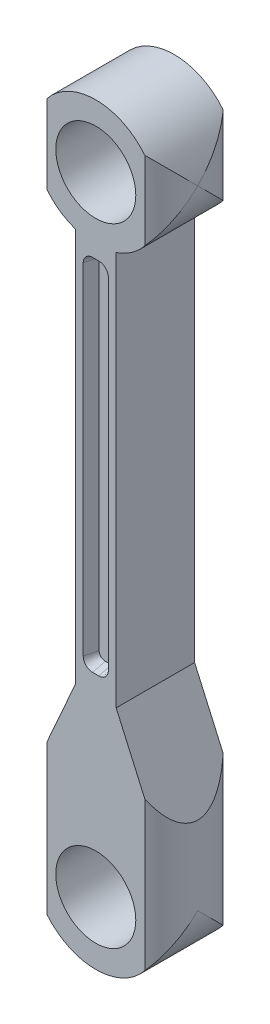
ISO-10303-21;
HEADER;
FILE_DESCRIPTION(('STEP AP214'),'2;1');
FILE_NAME('part.step','',(''),(''),'','','');
FILE_SCHEMA(('AUTOMOTIVE_DESIGN { 1 0 10303 214 1 1 1 1 }'));
ENDSEC;
DATA;
#1=APPLICATION_CONTEXT('core data for automotive mechanical design processes');
#2=APPLICATION_PROTOCOL_DEFINITION('international standard','automotive_design',2000,#1);
#3=PRODUCT_CONTEXT('',#1,'mechanical');
#4=PRODUCT('Part','Part','',(#3));
#5=PRODUCT_RELATED_PRODUCT_CATEGORY('part','',(#4));
#6=PRODUCT_DEFINITION_FORMATION('','',#4);
#7=PRODUCT_DEFINITION_CONTEXT('part definition',#1,'design');
#8=PRODUCT_DEFINITION('design','',#6,#7);
#9=PRODUCT_DEFINITION_SHAPE('','',#8);
#10=(LENGTH_UNIT() NAMED_UNIT(*) SI_UNIT(.MILLI.,.METRE.));
#11=(NAMED_UNIT(*) PLANE_ANGLE_UNIT() SI_UNIT($,.RADIAN.));
#12=(NAMED_UNIT(*) SI_UNIT($,.STERADIAN.) SOLID_ANGLE_UNIT());
#13=UNCERTAINTY_MEASURE_WITH_UNIT(LENGTH_MEASURE(1.E-05),#10,'distance_accuracy_value','');
#14=(GEOMETRIC_REPRESENTATION_CONTEXT(3) GLOBAL_UNCERTAINTY_ASSIGNED_CONTEXT((#13)) GLOBAL_UNIT_ASSIGNED_CONTEXT((#10,
#11,#12)) REPRESENTATION_CONTEXT('',''));
#15=CARTESIAN_POINT('',(0.,0.,0.));
#16=DIRECTION('',(0.,0.,1.));
#17=DIRECTION('',(1.,0.,0.));
#18=AXIS2_PLACEMENT_3D('',#15,#16,#17);
#19=CARTESIAN_POINT('',(0.,0.,6.35));
#20=DIRECTION('',(0.,0.,1.));
#21=DIRECTION('',(1.,0.,0.));
#22=AXIS2_PLACEMENT_3D('',#19,#20,#21);
#23=PLANE('',#22);
#24=CARTESIAN_POINT('',(-0.508,87.884,6.35));
#25=DIRECTION('',(0.,0.,1.));
#26=DIRECTION('',(1.,0.,0.));
#27=AXIS2_PLACEMENT_3D('',#24,#25,#26);
#28=CIRCLE('',#27,1.524);
#29=CARTESIAN_POINT('',(-0.507999999999989,89.408,6.35));
#30=VERTEX_POINT('',#29);
#31=CARTESIAN_POINT('',(-2.032,87.884,6.35));
#32=VERTEX_POINT('',#31);
#33=EDGE_CURVE('E271',#30,#32,#28,.T.);
#34=ORIENTED_EDGE('',*,*,#33,.F.);
#35=DIRECTION('',(1.,0.,0.));
#36=VECTOR('',#35,1.);
#37=CARTESIAN_POINT('',(0.,89.408,6.35));
#38=LINE('',#37,#36);
#39=CARTESIAN_POINT('',(0.507999999999989,89.408,6.35));
#40=VERTEX_POINT('',#39);
#41=EDGE_CURVE('E352',#30,#40,#38,.T.);
#42=ORIENTED_EDGE('',*,*,#41,.T.);
#43=CARTESIAN_POINT('',(0.508,87.884,6.35));
#44=DIRECTION('',(0.,0.,1.));
#45=DIRECTION('',(1.,0.,0.));
#46=AXIS2_PLACEMENT_3D('',#43,#44,#45);
#47=CIRCLE('',#46,1.524);
#48=CARTESIAN_POINT('',(2.032,87.884,6.35));
#49=VERTEX_POINT('',#48);
#50=EDGE_CURVE('E348',#49,#40,#47,.T.);
#51=ORIENTED_EDGE('',*,*,#50,.F.);
#52=DIRECTION('',(0.,-1.,0.));
#53=VECTOR('',#52,1.);
#54=CARTESIAN_POINT('',(2.032,0.,6.35));
#55=LINE('',#54,#53);
#56=CARTESIAN_POINT('',(2.032,32.766,6.35));
#57=VERTEX_POINT('',#56);
#58=EDGE_CURVE('E344',#49,#57,#55,.T.);
#59=ORIENTED_EDGE('',*,*,#58,.T.);
#60=CARTESIAN_POINT('',(0.508,32.766,6.35));
#61=DIRECTION('',(0.,0.,1.));
#62=DIRECTION('',(1.,0.,0.));
#63=AXIS2_PLACEMENT_3D('',#60,#61,#62);
#64=CIRCLE('',#63,1.524);
#65=CARTESIAN_POINT('',(0.507999999999989,31.242,6.35));
#66=VERTEX_POINT('',#65);
#67=EDGE_CURVE('E340',#66,#57,#64,.T.);
#68=ORIENTED_EDGE('',*,*,#67,.F.);
#69=DIRECTION('',(-1.,0.,0.));
#70=VECTOR('',#69,1.);
#71=CARTESIAN_POINT('',(0.,31.242,6.35));
#72=LINE('',#71,#70);
#73=CARTESIAN_POINT('',(-0.507999999999989,31.242,6.35));
#74=VERTEX_POINT('',#73);
#75=EDGE_CURVE('E336',#66,#74,#72,.T.);
#76=ORIENTED_EDGE('',*,*,#75,.T.);
#77=CARTESIAN_POINT('',(-0.508,32.766,6.35));
#78=DIRECTION('',(0.,0.,1.));
#79=DIRECTION('',(1.,0.,0.));
#80=AXIS2_PLACEMENT_3D('',#77,#78,#79);
#81=CIRCLE('',#80,1.524);
#82=CARTESIAN_POINT('',(-2.032,32.766,6.35));
#83=VERTEX_POINT('',#82);
#84=EDGE_CURVE('E332',#83,#74,#81,.T.);
#85=ORIENTED_EDGE('',*,*,#84,.F.);
#86=DIRECTION('',(0.,1.,0.));
#87=VECTOR('',#86,1.);
#88=CARTESIAN_POINT('',(-2.032,0.,6.35));
#89=LINE('',#88,#87);
#90=EDGE_CURVE('E328',#83,#32,#89,.T.);
#91=ORIENTED_EDGE('',*,*,#90,.T.);
#92=EDGE_LOOP('',(#34,#42,#51,#59,#68,#76,#85,#91));
#93=FACE_BOUND('',#92,.T.);
#94=CARTESIAN_POINT('',(0.,0.,6.35));
#95=DIRECTION('',(0.,0.,1.));
#96=DIRECTION('',(1.,0.,0.));
#97=AXIS2_PLACEMENT_3D('',#94,#95,#96);
#98=CIRCLE('',#97,6.477);
#99=CARTESIAN_POINT('',(6.477,0.,6.35));
#100=VERTEX_POINT('',#99);
#101=EDGE_CURVE('E418',#100,#100,#98,.T.);
#102=ORIENTED_EDGE('',*,*,#101,.F.);
#103=EDGE_LOOP('',(#102));
#104=FACE_BOUND('',#103,.T.);
#105=CARTESIAN_POINT('',(0.,101.6,6.35));
#106=DIRECTION('',(0.,0.,1.));
#107=DIRECTION('',(1.,0.,0.));
#108=AXIS2_PLACEMENT_3D('',#105,#106,#107);
#109=CIRCLE('',#108,6.477);
#110=CARTESIAN_POINT('',(6.477,101.6,6.35));
#111=VERTEX_POINT('',#110);
#112=EDGE_CURVE('E410',#111,#111,#109,.T.);
#113=ORIENTED_EDGE('',*,*,#112,.F.);
#114=EDGE_LOOP('',(#113));
#115=FACE_BOUND('',#114,.T.);
#116=CARTESIAN_POINT('',(0.,0.,6.35));
#117=DIRECTION('',(0.,0.,1.));
#118=DIRECTION('',(1.,0.,0.));
#119=AXIS2_PLACEMENT_3D('',#116,#117,#118);
#120=CIRCLE('',#119,10.16);
#121=CARTESIAN_POINT('',(-7.93114745796597,-6.35,6.35));
#122=VERTEX_POINT('',#121);
#123=CARTESIAN_POINT('',(7.93114745796597,-6.35,6.35));
#124=VERTEX_POINT('',#123);
#125=EDGE_CURVE('E256',#122,#124,#120,.T.);
#126=ORIENTED_EDGE('',*,*,#125,.T.);
#127=DIRECTION('',(0.,1.,0.));
#128=VECTOR('',#127,1.);
#129=CARTESIAN_POINT('',(7.93114745796597,-10.16,6.35));
#130=LINE('',#129,#128);
#131=CARTESIAN_POINT('',(7.93114745796597,17.7296916403592,6.35));
#132=VERTEX_POINT('',#131);
#133=EDGE_CURVE('E266',#124,#132,#130,.T.);
#134=ORIENTED_EDGE('',*,*,#133,.T.);
#135=DIRECTION('',(-0.405141586779864,0.914253955234263,0.));
#136=VECTOR('',#135,1.);
#137=CARTESIAN_POINT('',(10.16,12.7,6.35));
#138=LINE('',#137,#136);
#139=CARTESIAN_POINT('',(3.302,28.1759566274874,6.35));
#140=VERTEX_POINT('',#139);
#141=EDGE_CURVE('E428',#132,#140,#138,.T.);
#142=ORIENTED_EDGE('',*,*,#141,.T.);
#143=DIRECTION('',(0.,1.,0.));
#144=VECTOR('',#143,1.);
#145=CARTESIAN_POINT('',(3.302,28.1759566274874,6.35));
#146=LINE('',#145,#144);
#147=CARTESIAN_POINT('',(3.30199999999999,91.9915455977561,6.35));
#148=VERTEX_POINT('',#147);
#149=EDGE_CURVE('E432',#140,#148,#146,.T.);
#150=ORIENTED_EDGE('',*,*,#149,.T.);
#151=CARTESIAN_POINT('',(0.,101.6,6.35));
#152=DIRECTION('',(0.,0.,1.));
#153=DIRECTION('',(1.,0.,0.));
#154=AXIS2_PLACEMENT_3D('',#151,#152,#153);
#155=CIRCLE('',#154,10.16);
#156=CARTESIAN_POINT('',(7.93114745796597,95.25,6.35));
#157=VERTEX_POINT('',#156);
#158=EDGE_CURVE('E436',#148,#157,#155,.T.);
#159=ORIENTED_EDGE('',*,*,#158,.T.);
#160=CARTESIAN_POINT('',(7.93114745796597,107.95,6.35));
#161=VERTEX_POINT('',#160);
#162=EDGE_CURVE('E64',#157,#161,#130,.T.);
#163=ORIENTED_EDGE('',*,*,#162,.T.);
#164=CARTESIAN_POINT('',(-7.93114745796597,107.95,6.35));
#165=VERTEX_POINT('',#164);
#166=EDGE_CURVE('E440',#161,#165,#155,.T.);
#167=ORIENTED_EDGE('',*,*,#166,.T.);
#168=DIRECTION('',(0.,1.,0.));
#169=VECTOR('',#168,1.);
#170=CARTESIAN_POINT('',(-7.93114745796597,-10.16,6.35));
#171=LINE('',#170,#169);
#172=CARTESIAN_POINT('',(-7.93114745796597,95.25,6.35));
#173=VERTEX_POINT('',#172);
#174=EDGE_CURVE('E302',#165,#173,#171,.F.);
#175=ORIENTED_EDGE('',*,*,#174,.T.);
#176=CARTESIAN_POINT('',(-3.302,91.9915455977561,6.35));
#177=VERTEX_POINT('',#176);
#178=EDGE_CURVE('E435',#173,#177,#155,.T.);
#179=ORIENTED_EDGE('',*,*,#178,.T.);
#180=DIRECTION('',(0.,-1.,0.));
#181=VECTOR('',#180,1.);
#182=CARTESIAN_POINT('',(-3.302,28.1759566274874,6.35));
#183=LINE('',#182,#181);
#184=CARTESIAN_POINT('',(-3.302,28.1759566274874,6.35));
#185=VERTEX_POINT('',#184);
#186=EDGE_CURVE('E439',#177,#185,#183,.T.);
#187=ORIENTED_EDGE('',*,*,#186,.T.);
#188=DIRECTION('',(-0.405141586779864,-0.914253955234263,0.));
#189=VECTOR('',#188,1.);
#190=CARTESIAN_POINT('',(-10.16,12.7,6.35));
#191=LINE('',#190,#189);
#192=CARTESIAN_POINT('',(-7.93114745796597,17.7296916403592,6.35));
#193=VERTEX_POINT('',#192);
#194=EDGE_CURVE('E443',#185,#193,#191,.T.);
#195=ORIENTED_EDGE('',*,*,#194,.T.);
#196=EDGE_CURVE('E261',#193,#122,#171,.F.);
#197=ORIENTED_EDGE('',*,*,#196,.T.);
#198=EDGE_LOOP('',(#126,#134,#142,#150,#159,#163,#167,#175,#179,#187,#195,#197));
#199=FACE_BOUND('',#198,.T.);
#200=ADVANCED_FACE('F40',(#93,#104,#115,#199),#23,.T.);
#201=CARTESIAN_POINT('',(0.,0.,-6.35));
#202=DIRECTION('',(0.,0.,1.));
#203=DIRECTION('',(1.,0.,0.));
#204=AXIS2_PLACEMENT_3D('',#201,#202,#203);
#205=PLANE('',#204);
#206=CARTESIAN_POINT('',(-0.508,87.884,-6.35));
#207=DIRECTION('',(0.,0.,1.));
#208=DIRECTION('',(1.,0.,0.));
#209=AXIS2_PLACEMENT_3D('',#206,#207,#208);
#210=CIRCLE('',#209,1.524);
#211=CARTESIAN_POINT('',(-0.507999999999989,89.408,-6.35));
#212=VERTEX_POINT('',#211);
#213=CARTESIAN_POINT('',(-2.032,87.884,-6.35));
#214=VERTEX_POINT('',#213);
#215=EDGE_CURVE('E508',#212,#214,#210,.T.);
#216=ORIENTED_EDGE('',*,*,#215,.T.);
#217=DIRECTION('',(0.,1.,0.));
#218=VECTOR('',#217,1.);
#219=CARTESIAN_POINT('',(-2.032,0.,-6.35));
#220=LINE('',#219,#218);
#221=CARTESIAN_POINT('',(-2.032,32.766,-6.35));
#222=VERTEX_POINT('',#221);
#223=EDGE_CURVE('E520',#222,#214,#220,.T.);
#224=ORIENTED_EDGE('',*,*,#223,.F.);
#225=CARTESIAN_POINT('',(-0.508,32.766,-6.35));
#226=DIRECTION('',(0.,0.,1.));
#227=DIRECTION('',(1.,0.,0.));
#228=AXIS2_PLACEMENT_3D('',#225,#226,#227);
#229=CIRCLE('',#228,1.524);
#230=CARTESIAN_POINT('',(-0.507999999999989,31.242,-6.35));
#231=VERTEX_POINT('',#230);
#232=EDGE_CURVE('E530',#222,#231,#229,.T.);
#233=ORIENTED_EDGE('',*,*,#232,.T.);
#234=DIRECTION('',(-1.,0.,0.));
#235=VECTOR('',#234,1.);
#236=CARTESIAN_POINT('',(0.,31.242,-6.35));
#237=LINE('',#236,#235);
#238=CARTESIAN_POINT('',(0.507999999999989,31.242,-6.35));
#239=VERTEX_POINT('',#238);
#240=EDGE_CURVE('E542',#239,#231,#237,.T.);
#241=ORIENTED_EDGE('',*,*,#240,.F.);
#242=CARTESIAN_POINT('',(0.508,32.766,-6.35));
#243=DIRECTION('',(0.,0.,1.));
#244=DIRECTION('',(1.,0.,0.));
#245=AXIS2_PLACEMENT_3D('',#242,#243,#244);
#246=CIRCLE('',#245,1.524);
#247=CARTESIAN_POINT('',(2.032,32.766,-6.35));
#248=VERTEX_POINT('',#247);
#249=EDGE_CURVE('E552',#239,#248,#246,.T.);
#250=ORIENTED_EDGE('',*,*,#249,.T.);
#251=DIRECTION('',(0.,-1.,0.));
#252=VECTOR('',#251,1.);
#253=CARTESIAN_POINT('',(2.032,0.,-6.35));
#254=LINE('',#253,#252);
#255=CARTESIAN_POINT('',(2.032,87.884,-6.35));
#256=VERTEX_POINT('',#255);
#257=EDGE_CURVE('E49',#256,#248,#254,.T.);
#258=ORIENTED_EDGE('',*,*,#257,.F.);
#259=CARTESIAN_POINT('',(0.508,87.884,-6.35));
#260=DIRECTION('',(0.,0.,1.));
#261=DIRECTION('',(1.,0.,0.));
#262=AXIS2_PLACEMENT_3D('',#259,#260,#261);
#263=CIRCLE('',#262,1.524);
#264=CARTESIAN_POINT('',(0.507999999999989,89.408,-6.35));
#265=VERTEX_POINT('',#264);
#266=EDGE_CURVE('E482',#256,#265,#263,.T.);
#267=ORIENTED_EDGE('',*,*,#266,.T.);
#268=DIRECTION('',(1.,0.,0.));
#269=VECTOR('',#268,1.);
#270=CARTESIAN_POINT('',(0.,89.408,-6.35));
#271=LINE('',#270,#269);
#272=EDGE_CURVE('E498',#212,#265,#271,.T.);
#273=ORIENTED_EDGE('',*,*,#272,.F.);
#274=EDGE_LOOP('',(#216,#224,#233,#241,#250,#258,#267,#273));
#275=FACE_BOUND('',#274,.T.);
#276=CARTESIAN_POINT('',(0.,0.,-6.35));
#277=DIRECTION('',(0.,0.,1.));
#278=DIRECTION('',(1.,0.,0.));
#279=AXIS2_PLACEMENT_3D('',#276,#277,#278);
#280=CIRCLE('',#279,6.477);
#281=CARTESIAN_POINT('',(6.477,0.,-6.35));
#282=VERTEX_POINT('',#281);
#283=EDGE_CURVE('E414',#282,#282,#280,.T.);
#284=ORIENTED_EDGE('',*,*,#283,.T.);
#285=EDGE_LOOP('',(#284));
#286=FACE_BOUND('',#285,.T.);
#287=CARTESIAN_POINT('',(0.,101.6,-6.35));
#288=DIRECTION('',(0.,0.,1.));
#289=DIRECTION('',(1.,0.,0.));
#290=AXIS2_PLACEMENT_3D('',#287,#288,#289);
#291=CIRCLE('',#290,6.477);
#292=CARTESIAN_POINT('',(6.477,101.6,-6.35));
#293=VERTEX_POINT('',#292);
#294=EDGE_CURVE('E360',#293,#293,#291,.T.);
#295=ORIENTED_EDGE('',*,*,#294,.T.);
#296=EDGE_LOOP('',(#295));
#297=FACE_BOUND('',#296,.T.);
#298=DIRECTION('',(0.,1.,0.));
#299=VECTOR('',#298,1.);
#300=CARTESIAN_POINT('',(7.93114745796597,-10.16,-6.35));
#301=LINE('',#300,#299);
#302=CARTESIAN_POINT('',(7.93114745796597,-6.35,-6.35));
#303=VERTEX_POINT('',#302);
#304=CARTESIAN_POINT('',(7.93114745796597,17.7296916403592,-6.35));
#305=VERTEX_POINT('',#304);
#306=EDGE_CURVE('E273',#303,#305,#301,.T.);
#307=ORIENTED_EDGE('',*,*,#306,.F.);
#308=CARTESIAN_POINT('',(0.,0.,-6.35));
#309=DIRECTION('',(0.,0.,1.));
#310=DIRECTION('',(1.,0.,0.));
#311=AXIS2_PLACEMENT_3D('',#308,#309,#310);
#312=CIRCLE('',#311,10.16);
#313=CARTESIAN_POINT('',(-7.93114745796597,-6.35,-6.35));
#314=VERTEX_POINT('',#313);
#315=EDGE_CURVE('E422',#314,#303,#312,.T.);
#316=ORIENTED_EDGE('',*,*,#315,.F.);
#317=DIRECTION('',(0.,1.,0.));
#318=VECTOR('',#317,1.);
#319=CARTESIAN_POINT('',(-7.93114745796597,-10.16,-6.35));
#320=LINE('',#319,#318);
#321=CARTESIAN_POINT('',(-7.93114745796597,17.7296916403592,-6.35));
#322=VERTEX_POINT('',#321);
#323=EDGE_CURVE('E243',#322,#314,#320,.F.);
#324=ORIENTED_EDGE('',*,*,#323,.F.);
#325=DIRECTION('',(-0.405141586779864,-0.914253955234263,0.));
#326=VECTOR('',#325,1.);
#327=CARTESIAN_POINT('',(-10.16,12.7,-6.35));
#328=LINE('',#327,#326);
#329=CARTESIAN_POINT('',(-3.302,28.1759566274874,-6.35));
#330=VERTEX_POINT('',#329);
#331=EDGE_CURVE('E429',#330,#322,#328,.T.);
#332=ORIENTED_EDGE('',*,*,#331,.F.);
#333=DIRECTION('',(0.,-1.,0.));
#334=VECTOR('',#333,1.);
#335=CARTESIAN_POINT('',(-3.302,28.1759566274874,-6.35));
#336=LINE('',#335,#334);
#337=CARTESIAN_POINT('',(-3.302,91.9915455977561,-6.35));
#338=VERTEX_POINT('',#337);
#339=EDGE_CURVE('E460',#338,#330,#336,.T.);
#340=ORIENTED_EDGE('',*,*,#339,.F.);
#341=CARTESIAN_POINT('',(0.,101.6,-6.35));
#342=DIRECTION('',(0.,0.,1.));
#343=DIRECTION('',(1.,0.,0.));
#344=AXIS2_PLACEMENT_3D('',#341,#342,#343);
#345=CIRCLE('',#344,10.16);
#346=CARTESIAN_POINT('',(-7.93114745796597,95.25,-6.35));
#347=VERTEX_POINT('',#346);
#348=EDGE_CURVE('E455',#347,#338,#345,.T.);
#349=ORIENTED_EDGE('',*,*,#348,.F.);
#350=CARTESIAN_POINT('',(-7.93114745796597,107.95,-6.35));
#351=VERTEX_POINT('',#350);
#352=EDGE_CURVE('E263',#351,#347,#320,.F.);
#353=ORIENTED_EDGE('',*,*,#352,.F.);
#354=CARTESIAN_POINT('',(7.93114745796597,107.95,-6.35));
#355=VERTEX_POINT('',#354);
#356=EDGE_CURVE('E461',#355,#351,#345,.T.);
#357=ORIENTED_EDGE('',*,*,#356,.F.);
#358=CARTESIAN_POINT('',(7.93114745796597,95.25,-6.35));
#359=VERTEX_POINT('',#358);
#360=EDGE_CURVE('E280',#359,#355,#301,.T.);
#361=ORIENTED_EDGE('',*,*,#360,.F.);
#362=CARTESIAN_POINT('',(3.30199999999999,91.9915455977561,-6.35));
#363=VERTEX_POINT('',#362);
#364=EDGE_CURVE('E456',#363,#359,#345,.T.);
#365=ORIENTED_EDGE('',*,*,#364,.F.);
#366=DIRECTION('',(0.,1.,0.));
#367=VECTOR('',#366,1.);
#368=CARTESIAN_POINT('',(3.302,28.1759566274874,-6.35));
#369=LINE('',#368,#367);
#370=CARTESIAN_POINT('',(3.302,28.1759566274874,-6.35));
#371=VERTEX_POINT('',#370);
#372=EDGE_CURVE('E452',#371,#363,#369,.T.);
#373=ORIENTED_EDGE('',*,*,#372,.F.);
#374=DIRECTION('',(-0.405141586779864,0.914253955234263,0.));
#375=VECTOR('',#374,1.);
#376=CARTESIAN_POINT('',(10.16,12.7,-6.35));
#377=LINE('',#376,#375);
#378=EDGE_CURVE('E449',#305,#371,#377,.T.);
#379=ORIENTED_EDGE('',*,*,#378,.F.);
#380=EDGE_LOOP('',(#307,#316,#324,#332,#340,#349,#353,#357,#361,#365,#373,#379));
#381=FACE_BOUND('',#380,.T.);
#382=ADVANCED_FACE('F574',(#275,#286,#297,#381),#205,.F.);
#383=CARTESIAN_POINT('',(0.,0.,6.35));
#384=DIRECTION('',(0.,0.,-1.));
#385=DIRECTION('',(-1.,0.,0.));
#386=AXIS2_PLACEMENT_3D('',#383,#384,#385);
#387=CYLINDRICAL_SURFACE('',#386,10.16);
#388=CARTESIAN_POINT('',(0.,0.,0.));
#389=DIRECTION('',(0.,0.707106781186547,-0.707106781186547));
#390=DIRECTION('',(0.,-0.707106781186547,-0.707106781186547));
#391=AXIS2_PLACEMENT_3D('',#388,#389,#390);
#392=ELLIPSE('',#391,14.3684097937106,10.16);
#393=CARTESIAN_POINT('',(-10.16,0.,0.));
#394=VERTEX_POINT('',#393);
#395=EDGE_CURVE('E237',#314,#394,#392,.T.);
#396=ORIENTED_EDGE('',*,*,#395,.F.);
#397=ORIENTED_EDGE('',*,*,#315,.T.);
#398=CARTESIAN_POINT('',(10.16,0.,0.));
#399=VERTEX_POINT('',#398);
#400=EDGE_CURVE('E251',#399,#303,#392,.T.);
#401=ORIENTED_EDGE('',*,*,#400,.F.);
#402=CARTESIAN_POINT('',(0.,0.,0.));
#403=DIRECTION('',(0.,-0.707106781186547,-0.707106781186547));
#404=DIRECTION('',(0.,0.707106781186547,-0.707106781186547));
#405=AXIS2_PLACEMENT_3D('',#402,#403,#404);
#406=ELLIPSE('',#405,14.3684097937106,10.16);
#407=EDGE_CURVE('E259',#124,#399,#406,.F.);
#408=ORIENTED_EDGE('',*,*,#407,.F.);
#409=ORIENTED_EDGE('',*,*,#125,.F.);
#410=EDGE_CURVE('E240',#394,#122,#406,.F.);
#411=ORIENTED_EDGE('',*,*,#410,.F.);
#412=EDGE_LOOP('',(#396,#397,#401,#408,#409,#411));
#413=FACE_BOUND('',#412,.T.);
#414=ADVANCED_FACE('F253',(#413),#387,.T.);
#415=CARTESIAN_POINT('',(10.16,12.7,6.35));
#416=DIRECTION('',(-0.914253955234263,-0.405141586779864,0.));
#417=DIRECTION('',(0.405141586779864,-0.914253955234263,0.));
#418=AXIS2_PLACEMENT_3D('',#415,#416,#417);
#419=PLANE('',#418);
#420=CARTESIAN_POINT('',(0.,35.6273431518331,0.));
#421=DIRECTION('',(-0.914253955234263,-0.405141586779864,0.));
#422=DIRECTION('',(-0.405141586779864,0.914253955234263,0.));
#423=AXIS2_PLACEMENT_3D('',#420,#421,#422);
#424=ELLIPSE('',#423,25.0776526812601,10.16);
#425=EDGE_CURVE('E278',#305,#132,#424,.T.);
#426=ORIENTED_EDGE('',*,*,#425,.F.);
#427=ORIENTED_EDGE('',*,*,#378,.T.);
#428=DIRECTION('',(0.,0.,-1.));
#429=VECTOR('',#428,1.);
#430=CARTESIAN_POINT('',(3.302,28.1759566274874,6.35));
#431=LINE('',#430,#429);
#432=EDGE_CURVE('E478',#140,#371,#431,.T.);
#433=ORIENTED_EDGE('',*,*,#432,.F.);
#434=ORIENTED_EDGE('',*,*,#141,.F.);
#435=EDGE_LOOP('',(#426,#427,#433,#434));
#436=FACE_BOUND('',#435,.T.);
#437=ADVANCED_FACE('F635',(#436),#419,.F.);
#438=CARTESIAN_POINT('',(0.,101.6,6.35));
#439=DIRECTION('',(0.,0.,-1.));
#440=DIRECTION('',(-1.,0.,0.));
#441=AXIS2_PLACEMENT_3D('',#438,#439,#440);
#442=CYLINDRICAL_SURFACE('',#441,10.16);
#443=CARTESIAN_POINT('',(0.,101.6,0.));
#444=DIRECTION('',(0.,0.707106781186547,-0.707106781186547));
#445=DIRECTION('',(0.,-0.707106781186547,-0.707106781186547));
#446=AXIS2_PLACEMENT_3D('',#443,#444,#445);
#447=ELLIPSE('',#446,14.3684097937106,10.16);
#448=CARTESIAN_POINT('',(10.16,101.6,0.));
#449=VERTEX_POINT('',#448);
#450=EDGE_CURVE('E289',#449,#161,#447,.F.);
#451=ORIENTED_EDGE('',*,*,#450,.F.);
#452=CARTESIAN_POINT('',(0.,101.6,0.));
#453=DIRECTION('',(0.,-0.707106781186547,-0.707106781186547));
#454=DIRECTION('',(0.,0.707106781186547,-0.707106781186547));
#455=AXIS2_PLACEMENT_3D('',#452,#453,#454);
#456=ELLIPSE('',#455,14.3684097937106,10.16);
#457=EDGE_CURVE('E290',#355,#449,#456,.T.);
#458=ORIENTED_EDGE('',*,*,#457,.F.);
#459=ORIENTED_EDGE('',*,*,#356,.T.);
#460=CARTESIAN_POINT('',(-10.16,101.6,0.));
#461=VERTEX_POINT('',#460);
#462=EDGE_CURVE('E296',#461,#351,#456,.T.);
#463=ORIENTED_EDGE('',*,*,#462,.F.);
#464=EDGE_CURVE('E310',#165,#461,#447,.F.);
#465=ORIENTED_EDGE('',*,*,#464,.F.);
#466=ORIENTED_EDGE('',*,*,#166,.F.);
#467=EDGE_LOOP('',(#451,#458,#459,#463,#465,#466));
#468=FACE_BOUND('',#467,.T.);
#469=ADVANCED_FACE('F631',(#468),#442,.T.);
#470=CARTESIAN_POINT('',(0.,101.6,0.));
#471=DIRECTION('',(0.,0.707106781186547,-0.707106781186547));
#472=DIRECTION('',(0.,-0.707106781186547,-0.707106781186547));
#473=AXIS2_PLACEMENT_3D('',#470,#471,#472);
#474=ELLIPSE('',#473,14.3684097937106,10.16);
#475=EDGE_CURVE('E283',#449,#359,#474,.T.);
#476=ORIENTED_EDGE('',*,*,#475,.F.);
#477=CARTESIAN_POINT('',(0.,101.6,0.));
#478=DIRECTION('',(0.,-0.707106781186547,-0.707106781186547));
#479=DIRECTION('',(0.,0.707106781186547,-0.707106781186547));
#480=AXIS2_PLACEMENT_3D('',#477,#478,#479);
#481=ELLIPSE('',#480,14.3684097937106,10.16);
#482=EDGE_CURVE('E248',#157,#449,#481,.F.);
#483=ORIENTED_EDGE('',*,*,#482,.F.);
#484=ORIENTED_EDGE('',*,*,#158,.F.);
#485=DIRECTION('',(0.,0.,-1.));
#486=VECTOR('',#485,1.);
#487=CARTESIAN_POINT('',(3.30199999999999,91.9915455977561,6.35));
#488=LINE('',#487,#486);
#489=EDGE_CURVE('E474',#148,#363,#488,.T.);
#490=ORIENTED_EDGE('',*,*,#489,.T.);
#491=ORIENTED_EDGE('',*,*,#364,.T.);
#492=EDGE_LOOP('',(#476,#483,#484,#490,#491));
#493=FACE_BOUND('',#492,.T.);
#494=ADVANCED_FACE('F634',(#493),#442,.T.);
#495=EDGE_CURVE('E56',#347,#461,#474,.T.);
#496=ORIENTED_EDGE('',*,*,#495,.F.);
#497=ORIENTED_EDGE('',*,*,#348,.T.);
#498=DIRECTION('',(0.,0.,-1.));
#499=VECTOR('',#498,1.);
#500=CARTESIAN_POINT('',(-3.302,91.9915455977561,6.35));
#501=LINE('',#500,#499);
#502=EDGE_CURVE('E470',#177,#338,#501,.T.);
#503=ORIENTED_EDGE('',*,*,#502,.F.);
#504=ORIENTED_EDGE('',*,*,#178,.F.);
#505=EDGE_CURVE('E299',#461,#173,#481,.F.);
#506=ORIENTED_EDGE('',*,*,#505,.F.);
#507=EDGE_LOOP('',(#496,#497,#503,#504,#506));
#508=FACE_BOUND('',#507,.T.);
#509=ADVANCED_FACE('F624',(#508),#442,.T.);
#510=CARTESIAN_POINT('',(-10.16,12.7,6.35));
#511=DIRECTION('',(0.914253955234263,-0.405141586779864,0.));
#512=DIRECTION('',(0.405141586779864,0.914253955234263,0.));
#513=AXIS2_PLACEMENT_3D('',#510,#511,#512);
#514=PLANE('',#513);
#515=CARTESIAN_POINT('',(0.,35.6273431518331,0.));
#516=DIRECTION('',(0.914253955234263,-0.405141586779864,0.));
#517=DIRECTION('',(0.405141586779864,0.914253955234263,0.));
#518=AXIS2_PLACEMENT_3D('',#515,#516,#517);
#519=ELLIPSE('',#518,25.0776526812601,10.16);
#520=EDGE_CURVE('E249',#193,#322,#519,.T.);
#521=ORIENTED_EDGE('',*,*,#520,.F.);
#522=ORIENTED_EDGE('',*,*,#194,.F.);
#523=DIRECTION('',(0.,0.,-1.));
#524=VECTOR('',#523,1.);
#525=CARTESIAN_POINT('',(-3.302,28.1759566274874,6.35));
#526=LINE('',#525,#524);
#527=EDGE_CURVE('E446',#185,#330,#526,.T.);
#528=ORIENTED_EDGE('',*,*,#527,.T.);
#529=ORIENTED_EDGE('',*,*,#331,.T.);
#530=EDGE_LOOP('',(#521,#522,#528,#529));
#531=FACE_BOUND('',#530,.T.);
#532=ADVANCED_FACE('F621',(#531),#514,.F.);
#533=CARTESIAN_POINT('',(-0.508,87.884,-4.318));
#534=DIRECTION('',(0.,0.,-1.));
#535=DIRECTION('',(1.,0.,0.));
#536=AXIS2_PLACEMENT_3D('',#533,#534,#535);
#537=PLANE('',#536);
#538=CARTESIAN_POINT('',(-0.508,87.884,-4.318));
#539=DIRECTION('',(0.,0.,1.));
#540=DIRECTION('',(1.,0.,0.));
#541=AXIS2_PLACEMENT_3D('',#538,#539,#540);
#542=CIRCLE('',#541,0.979527240979956);
#543=CARTESIAN_POINT('',(-0.507999999999989,88.86352724098,-4.318));
#544=VERTEX_POINT('',#543);
#545=CARTESIAN_POINT('',(-1.48752724097996,87.884,-4.318));
#546=VERTEX_POINT('',#545);
#547=EDGE_CURVE('E516',#544,#546,#542,.T.);
#548=ORIENTED_EDGE('',*,*,#547,.F.);
#549=DIRECTION('',(-1.,0.,0.));
#550=VECTOR('',#549,1.);
#551=CARTESIAN_POINT('',(-0.508,88.86352724098,-4.318));
#552=LINE('',#551,#550);
#553=CARTESIAN_POINT('',(0.507999999999993,88.86352724098,-4.318));
#554=VERTEX_POINT('',#553);
#555=EDGE_CURVE('E505',#544,#554,#552,.F.);
#556=ORIENTED_EDGE('',*,*,#555,.T.);
#557=CARTESIAN_POINT('',(0.508,87.884,-4.318));
#558=DIRECTION('',(0.,0.,1.));
#559=DIRECTION('',(1.,0.,0.));
#560=AXIS2_PLACEMENT_3D('',#557,#558,#559);
#561=CIRCLE('',#560,0.979527240979956);
#562=CARTESIAN_POINT('',(1.48752724097996,87.884,-4.318));
#563=VERTEX_POINT('',#562);
#564=EDGE_CURVE('E490',#563,#554,#561,.T.);
#565=ORIENTED_EDGE('',*,*,#564,.F.);
#566=DIRECTION('',(0.,1.,0.));
#567=VECTOR('',#566,1.);
#568=CARTESIAN_POINT('',(1.48752724097996,87.884,-4.318));
#569=LINE('',#568,#567);
#570=CARTESIAN_POINT('',(1.48752724097996,32.766,-4.318));
#571=VERTEX_POINT('',#570);
#572=EDGE_CURVE('E12',#563,#571,#569,.F.);
#573=ORIENTED_EDGE('',*,*,#572,.T.);
#574=CARTESIAN_POINT('',(0.508,32.766,-4.318));
#575=DIRECTION('',(0.,0.,1.));
#576=DIRECTION('',(1.,0.,0.));
#577=AXIS2_PLACEMENT_3D('',#574,#575,#576);
#578=CIRCLE('',#577,0.979527240979956);
#579=CARTESIAN_POINT('',(0.507999999999989,31.78647275902,-4.318));
#580=VERTEX_POINT('',#579);
#581=EDGE_CURVE('E560',#580,#571,#578,.T.);
#582=ORIENTED_EDGE('',*,*,#581,.F.);
#583=DIRECTION('',(1.,0.,0.));
#584=VECTOR('',#583,1.);
#585=CARTESIAN_POINT('',(-0.508,31.78647275902,-4.318));
#586=LINE('',#585,#584);
#587=CARTESIAN_POINT('',(-0.507999999999993,31.78647275902,-4.318));
#588=VERTEX_POINT('',#587);
#589=EDGE_CURVE('E549',#580,#588,#586,.F.);
#590=ORIENTED_EDGE('',*,*,#589,.T.);
#591=CARTESIAN_POINT('',(-0.508,32.766,-4.318));
#592=DIRECTION('',(0.,0.,1.));
#593=DIRECTION('',(1.,0.,0.));
#594=AXIS2_PLACEMENT_3D('',#591,#592,#593);
#595=CIRCLE('',#594,0.979527240979956);
#596=CARTESIAN_POINT('',(-1.48752724097996,32.766,-4.318));
#597=VERTEX_POINT('',#596);
#598=EDGE_CURVE('E538',#597,#588,#595,.T.);
#599=ORIENTED_EDGE('',*,*,#598,.F.);
#600=DIRECTION('',(0.,-1.,0.));
#601=VECTOR('',#600,1.);
#602=CARTESIAN_POINT('',(-1.48752724097996,87.884,-4.318));
#603=LINE('',#602,#601);
#604=EDGE_CURVE('E527',#597,#546,#603,.F.);
#605=ORIENTED_EDGE('',*,*,#604,.T.);
#606=EDGE_LOOP('',(#548,#556,#565,#573,#582,#590,#599,#605));
#607=FACE_BOUND('',#606,.T.);
#608=ADVANCED_FACE('F42',(#607),#537,.T.);
#609=CARTESIAN_POINT('',(2.032,0.,-6.35));
#610=DIRECTION('',(0.965925826289068,0.,0.258819045102521));
#611=DIRECTION('',(-0.258819045102521,0.,0.965925826289068));
#612=AXIS2_PLACEMENT_3D('',#609,#610,#611);
#613=PLANE('',#612);
#614=ORIENTED_EDGE('',*,*,#257,.T.);
#615=DIRECTION('',(0.258819045102521,0.,-0.965925826289068));
#616=VECTOR('',#615,1.);
#617=CARTESIAN_POINT('',(2.032,32.766,-6.35));
#618=LINE('',#617,#616);
#619=EDGE_CURVE('E556',#571,#248,#618,.T.);
#620=ORIENTED_EDGE('',*,*,#619,.F.);
#621=ORIENTED_EDGE('',*,*,#572,.F.);
#622=DIRECTION('',(0.258819045102521,0.,-0.965925826289068));
#623=VECTOR('',#622,1.);
#624=CARTESIAN_POINT('',(2.032,87.884,-6.35));
#625=LINE('',#624,#623);
#626=EDGE_CURVE('E494',#563,#256,#625,.T.);
#627=ORIENTED_EDGE('',*,*,#626,.T.);
#628=EDGE_LOOP('',(#614,#620,#621,#627));
#629=FACE_BOUND('',#628,.T.);
#630=ADVANCED_FACE('F566',(#629),#613,.F.);
#631=CARTESIAN_POINT('',(0.508,32.766,-6.35));
#632=DIRECTION('',(0.,0.,-1.));
#633=DIRECTION('',(1.,0.,0.));
#634=AXIS2_PLACEMENT_3D('',#631,#632,#633);
#635=CONICAL_SURFACE('',#634,1.524,0.26179938779915);
#636=ORIENTED_EDGE('',*,*,#249,.F.);
#637=DIRECTION('',(0.,-0.258819045102521,-0.965925826289068));
#638=VECTOR('',#637,1.);
#639=CARTESIAN_POINT('',(0.507999999999989,31.242,-6.35));
#640=LINE('',#639,#638);
#641=EDGE_CURVE('E545',#580,#239,#640,.T.);
#642=ORIENTED_EDGE('',*,*,#641,.F.);
#643=ORIENTED_EDGE('',*,*,#581,.T.);
#644=ORIENTED_EDGE('',*,*,#619,.T.);
#645=EDGE_LOOP('',(#636,#642,#643,#644));
#646=FACE_BOUND('',#645,.T.);
#647=ADVANCED_FACE('F571',(#646),#635,.F.);
#648=CARTESIAN_POINT('',(0.,31.242,-6.35));
#649=DIRECTION('',(0.,-0.965925826289068,0.258819045102521));
#650=DIRECTION('',(0.,0.258819045102521,0.965925826289068));
#651=AXIS2_PLACEMENT_3D('',#648,#649,#650);
#652=PLANE('',#651);
#653=ORIENTED_EDGE('',*,*,#240,.T.);
#654=DIRECTION('',(0.,-0.258819045102521,-0.965925826289068));
#655=VECTOR('',#654,1.);
#656=CARTESIAN_POINT('',(-0.507999999999989,31.242,-6.35));
#657=LINE('',#656,#655);
#658=EDGE_CURVE('E534',#588,#231,#657,.T.);
#659=ORIENTED_EDGE('',*,*,#658,.F.);
#660=ORIENTED_EDGE('',*,*,#589,.F.);
#661=ORIENTED_EDGE('',*,*,#641,.T.);
#662=EDGE_LOOP('',(#653,#659,#660,#661));
#663=FACE_BOUND('',#662,.T.);
#664=ADVANCED_FACE('F579',(#663),#652,.F.);
#665=CARTESIAN_POINT('',(-0.508,32.766,-6.35));
#666=DIRECTION('',(0.,0.,-1.));
#667=DIRECTION('',(1.,0.,0.));
#668=AXIS2_PLACEMENT_3D('',#665,#666,#667);
#669=CONICAL_SURFACE('',#668,1.524,0.26179938779915);
#670=ORIENTED_EDGE('',*,*,#232,.F.);
#671=DIRECTION('',(-0.258819045102521,0.,-0.965925826289068));
#672=VECTOR('',#671,1.);
#673=CARTESIAN_POINT('',(-2.032,32.766,-6.35));
#674=LINE('',#673,#672);
#675=EDGE_CURVE('E523',#597,#222,#674,.T.);
#676=ORIENTED_EDGE('',*,*,#675,.F.);
#677=ORIENTED_EDGE('',*,*,#598,.T.);
#678=ORIENTED_EDGE('',*,*,#658,.T.);
#679=EDGE_LOOP('',(#670,#676,#677,#678));
#680=FACE_BOUND('',#679,.T.);
#681=ADVANCED_FACE('F582',(#680),#669,.F.);
#682=CARTESIAN_POINT('',(-2.032,0.,-6.35));
#683=DIRECTION('',(-0.965925826289068,0.,0.258819045102521));
#684=DIRECTION('',(-0.258819045102521,0.,-0.965925826289068));
#685=AXIS2_PLACEMENT_3D('',#682,#683,#684);
#686=PLANE('',#685);
#687=ORIENTED_EDGE('',*,*,#223,.T.);
#688=DIRECTION('',(-0.258819045102521,0.,-0.965925826289068));
#689=VECTOR('',#688,1.);
#690=CARTESIAN_POINT('',(-2.032,87.884,-6.35));
#691=LINE('',#690,#689);
#692=EDGE_CURVE('E512',#546,#214,#691,.T.);
#693=ORIENTED_EDGE('',*,*,#692,.F.);
#694=ORIENTED_EDGE('',*,*,#604,.F.);
#695=ORIENTED_EDGE('',*,*,#675,.T.);
#696=EDGE_LOOP('',(#687,#693,#694,#695));
#697=FACE_BOUND('',#696,.T.);
#698=ADVANCED_FACE('F599',(#697),#686,.F.);
#699=CARTESIAN_POINT('',(-0.508,87.884,-6.35));
#700=DIRECTION('',(0.,0.,-1.));
#701=DIRECTION('',(1.,0.,0.));
#702=AXIS2_PLACEMENT_3D('',#699,#700,#701);
#703=CONICAL_SURFACE('',#702,1.524,0.26179938779915);
#704=ORIENTED_EDGE('',*,*,#215,.F.);
#705=DIRECTION('',(0.,0.258819045102521,-0.965925826289068));
#706=VECTOR('',#705,1.);
#707=CARTESIAN_POINT('',(-0.507999999999989,89.408,-6.35));
#708=LINE('',#707,#706);
#709=EDGE_CURVE('E501',#544,#212,#708,.T.);
#710=ORIENTED_EDGE('',*,*,#709,.F.);
#711=ORIENTED_EDGE('',*,*,#547,.T.);
#712=ORIENTED_EDGE('',*,*,#692,.T.);
#713=EDGE_LOOP('',(#704,#710,#711,#712));
#714=FACE_BOUND('',#713,.T.);
#715=ADVANCED_FACE('F597',(#714),#703,.F.);
#716=CARTESIAN_POINT('',(0.,89.408,-6.35));
#717=DIRECTION('',(0.,0.965925826289068,0.258819045102521));
#718=DIRECTION('',(0.,0.258819045102521,-0.965925826289068));
#719=AXIS2_PLACEMENT_3D('',#716,#717,#718);
#720=PLANE('',#719);
#721=ORIENTED_EDGE('',*,*,#272,.T.);
#722=DIRECTION('',(0.,0.258819045102521,-0.965925826289068));
#723=VECTOR('',#722,1.);
#724=CARTESIAN_POINT('',(0.507999999999989,89.408,-6.35));
#725=LINE('',#724,#723);
#726=EDGE_CURVE('E486',#554,#265,#725,.T.);
#727=ORIENTED_EDGE('',*,*,#726,.F.);
#728=ORIENTED_EDGE('',*,*,#555,.F.);
#729=ORIENTED_EDGE('',*,*,#709,.T.);
#730=EDGE_LOOP('',(#721,#727,#728,#729));
#731=FACE_BOUND('',#730,.T.);
#732=ADVANCED_FACE('F594',(#731),#720,.F.);
#733=CARTESIAN_POINT('',(0.508,87.884,-6.35));
#734=DIRECTION('',(0.,0.,-1.));
#735=DIRECTION('',(1.,0.,0.));
#736=AXIS2_PLACEMENT_3D('',#733,#734,#735);
#737=CONICAL_SURFACE('',#736,1.524,0.26179938779915);
#738=ORIENTED_EDGE('',*,*,#266,.F.);
#739=ORIENTED_EDGE('',*,*,#626,.F.);
#740=ORIENTED_EDGE('',*,*,#564,.T.);
#741=ORIENTED_EDGE('',*,*,#726,.T.);
#742=EDGE_LOOP('',(#738,#739,#740,#741));
#743=FACE_BOUND('',#742,.T.);
#744=ADVANCED_FACE('F591',(#743),#737,.F.);
#745=CARTESIAN_POINT('',(3.302,28.1759566274874,6.35));
#746=DIRECTION('',(-1.,0.,0.));
#747=DIRECTION('',(0.,-1.,0.));
#748=AXIS2_PLACEMENT_3D('',#745,#746,#747);
#749=PLANE('',#748);
#750=ORIENTED_EDGE('',*,*,#372,.T.);
#751=ORIENTED_EDGE('',*,*,#489,.F.);
#752=ORIENTED_EDGE('',*,*,#149,.F.);
#753=ORIENTED_EDGE('',*,*,#432,.T.);
#754=EDGE_LOOP('',(#750,#751,#752,#753));
#755=FACE_BOUND('',#754,.T.);
#756=ADVANCED_FACE('F629',(#755),#749,.F.);
#757=CARTESIAN_POINT('',(-3.302,28.1759566274874,6.35));
#758=DIRECTION('',(1.,0.,0.));
#759=DIRECTION('',(0.,0.,-1.));
#760=AXIS2_PLACEMENT_3D('',#757,#758,#759);
#761=PLANE('',#760);
#762=ORIENTED_EDGE('',*,*,#339,.T.);
#763=ORIENTED_EDGE('',*,*,#527,.F.);
#764=ORIENTED_EDGE('',*,*,#186,.F.);
#765=ORIENTED_EDGE('',*,*,#502,.T.);
#766=EDGE_LOOP('',(#762,#763,#764,#765));
#767=FACE_BOUND('',#766,.T.);
#768=ADVANCED_FACE('F626',(#767),#761,.F.);
#769=CARTESIAN_POINT('',(0.,0.,6.35));
#770=DIRECTION('',(0.,0.,-1.));
#771=DIRECTION('',(-1.,0.,0.));
#772=AXIS2_PLACEMENT_3D('',#769,#770,#771);
#773=CYLINDRICAL_SURFACE('',#772,6.477);
#774=ORIENTED_EDGE('',*,*,#101,.T.);
#775=EDGE_LOOP('',(#774));
#776=FACE_BOUND('',#775,.T.);
#777=ORIENTED_EDGE('',*,*,#283,.F.);
#778=EDGE_LOOP('',(#777));
#779=FACE_BOUND('',#778,.T.);
#780=ADVANCED_FACE('F618',(#776,#779),#773,.F.);
#781=CARTESIAN_POINT('',(0.,101.6,6.35));
#782=DIRECTION('',(0.,0.,-1.));
#783=DIRECTION('',(-1.,0.,0.));
#784=AXIS2_PLACEMENT_3D('',#781,#782,#783);
#785=CYLINDRICAL_SURFACE('',#784,6.477);
#786=ORIENTED_EDGE('',*,*,#112,.T.);
#787=EDGE_LOOP('',(#786));
#788=FACE_BOUND('',#787,.T.);
#789=ORIENTED_EDGE('',*,*,#294,.F.);
#790=EDGE_LOOP('',(#789));
#791=FACE_BOUND('',#790,.T.);
#792=ADVANCED_FACE('F670',(#788,#791),#785,.F.);
#793=CARTESIAN_POINT('',(-0.508,87.884,6.35));
#794=DIRECTION('',(0.,0.,1.));
#795=DIRECTION('',(1.,0.,0.));
#796=AXIS2_PLACEMENT_3D('',#793,#794,#795);
#797=CONICAL_SURFACE('',#796,1.524,0.26179938779915);
#798=ORIENTED_EDGE('',*,*,#33,.T.);
#799=DIRECTION('',(-0.258819045102521,0.,0.965925826289068));
#800=VECTOR('',#799,1.);
#801=CARTESIAN_POINT('',(-2.032,87.884,6.35));
#802=LINE('',#801,#800);
#803=CARTESIAN_POINT('',(-1.48752724097996,87.884,4.318));
#804=VERTEX_POINT('',#803);
#805=EDGE_CURVE('E362',#804,#32,#802,.T.);
#806=ORIENTED_EDGE('',*,*,#805,.F.);
#807=CARTESIAN_POINT('',(-0.508,87.884,4.318));
#808=DIRECTION('',(0.,0.,1.));
#809=DIRECTION('',(1.,0.,0.));
#810=AXIS2_PLACEMENT_3D('',#807,#808,#809);
#811=CIRCLE('',#810,0.979527240979956);
#812=CARTESIAN_POINT('',(-0.507999999999989,88.86352724098,4.318));
#813=VERTEX_POINT('',#812);
#814=EDGE_CURVE('E356',#813,#804,#811,.T.);
#815=ORIENTED_EDGE('',*,*,#814,.F.);
#816=DIRECTION('',(0.,0.258819045102521,0.965925826289068));
#817=VECTOR('',#816,1.);
#818=CARTESIAN_POINT('',(-0.507999999999989,89.408,6.35));
#819=LINE('',#818,#817);
#820=EDGE_CURVE('E357',#813,#30,#819,.T.);
#821=ORIENTED_EDGE('',*,*,#820,.T.);
#822=EDGE_LOOP('',(#798,#806,#815,#821));
#823=FACE_BOUND('',#822,.T.);
#824=ADVANCED_FACE('F677',(#823),#797,.F.);
#825=CARTESIAN_POINT('',(0.,89.408,6.35));
#826=DIRECTION('',(0.,0.965925826289068,-0.258819045102521));
#827=DIRECTION('',(0.,0.258819045102521,0.965925826289068));
#828=AXIS2_PLACEMENT_3D('',#825,#826,#827);
#829=PLANE('',#828);
#830=ORIENTED_EDGE('',*,*,#41,.F.);
#831=ORIENTED_EDGE('',*,*,#820,.F.);
#832=DIRECTION('',(-1.,0.,0.));
#833=VECTOR('',#832,1.);
#834=CARTESIAN_POINT('',(-0.508,88.86352724098,4.318));
#835=LINE('',#834,#833);
#836=CARTESIAN_POINT('',(0.507999999999993,88.86352724098,4.318));
#837=VERTEX_POINT('',#836);
#838=EDGE_CURVE('E367',#813,#837,#835,.F.);
#839=ORIENTED_EDGE('',*,*,#838,.T.);
#840=DIRECTION('',(0.,0.258819045102521,0.965925826289068));
#841=VECTOR('',#840,1.);
#842=CARTESIAN_POINT('',(0.507999999999989,89.408,6.35));
#843=LINE('',#842,#841);
#844=EDGE_CURVE('E361',#837,#40,#843,.T.);
#845=ORIENTED_EDGE('',*,*,#844,.T.);
#846=EDGE_LOOP('',(#830,#831,#839,#845));
#847=FACE_BOUND('',#846,.T.);
#848=ADVANCED_FACE('F684',(#847),#829,.F.);
#849=CARTESIAN_POINT('',(0.508,87.884,6.35));
#850=DIRECTION('',(0.,0.,1.));
#851=DIRECTION('',(1.,0.,0.));
#852=AXIS2_PLACEMENT_3D('',#849,#850,#851);
#853=CONICAL_SURFACE('',#852,1.524,0.26179938779915);
#854=ORIENTED_EDGE('',*,*,#50,.T.);
#855=ORIENTED_EDGE('',*,*,#844,.F.);
#856=CARTESIAN_POINT('',(0.508,87.884,4.318));
#857=DIRECTION('',(0.,0.,1.));
#858=DIRECTION('',(1.,0.,0.));
#859=AXIS2_PLACEMENT_3D('',#856,#857,#858);
#860=CIRCLE('',#859,0.979527240979956);
#861=CARTESIAN_POINT('',(1.48752724097996,87.884,4.318));
#862=VERTEX_POINT('',#861);
#863=EDGE_CURVE('E390',#862,#837,#860,.T.);
#864=ORIENTED_EDGE('',*,*,#863,.F.);
#865=DIRECTION('',(0.258819045102521,0.,0.965925826289068));
#866=VECTOR('',#865,1.);
#867=CARTESIAN_POINT('',(2.032,87.884,6.35));
#868=LINE('',#867,#866);
#869=EDGE_CURVE('E379',#862,#49,#868,.T.);
#870=ORIENTED_EDGE('',*,*,#869,.T.);
#871=EDGE_LOOP('',(#854,#855,#864,#870));
#872=FACE_BOUND('',#871,.T.);
#873=ADVANCED_FACE('F692',(#872),#853,.F.);
#874=CARTESIAN_POINT('',(2.032,0.,6.35));
#875=DIRECTION('',(0.965925826289068,0.,-0.258819045102521));
#876=DIRECTION('',(-0.258819045102521,0.,-0.965925826289068));
#877=AXIS2_PLACEMENT_3D('',#874,#875,#876);
#878=PLANE('',#877);
#879=ORIENTED_EDGE('',*,*,#58,.F.);
#880=ORIENTED_EDGE('',*,*,#869,.F.);
#881=DIRECTION('',(0.,1.,0.));
#882=VECTOR('',#881,1.);
#883=CARTESIAN_POINT('',(1.48752724097996,87.884,4.318));
#884=LINE('',#883,#882);
#885=CARTESIAN_POINT('',(1.48752724097996,32.766,4.318));
#886=VERTEX_POINT('',#885);
#887=EDGE_CURVE('E394',#862,#886,#884,.F.);
#888=ORIENTED_EDGE('',*,*,#887,.T.);
#889=DIRECTION('',(0.258819045102521,0.,0.965925826289068));
#890=VECTOR('',#889,1.);
#891=CARTESIAN_POINT('',(2.032,32.766,6.35));
#892=LINE('',#891,#890);
#893=EDGE_CURVE('E376',#886,#57,#892,.T.);
#894=ORIENTED_EDGE('',*,*,#893,.T.);
#895=EDGE_LOOP('',(#879,#880,#888,#894));
#896=FACE_BOUND('',#895,.T.);
#897=ADVANCED_FACE('F700',(#896),#878,.F.);
#898=CARTESIAN_POINT('',(0.508,32.766,6.35));
#899=DIRECTION('',(0.,0.,1.));
#900=DIRECTION('',(1.,0.,0.));
#901=AXIS2_PLACEMENT_3D('',#898,#899,#900);
#902=CONICAL_SURFACE('',#901,1.524,0.26179938779915);
#903=ORIENTED_EDGE('',*,*,#67,.T.);
#904=ORIENTED_EDGE('',*,*,#893,.F.);
#905=CARTESIAN_POINT('',(0.508,32.766,4.318));
#906=DIRECTION('',(0.,0.,1.));
#907=DIRECTION('',(1.,0.,0.));
#908=AXIS2_PLACEMENT_3D('',#905,#906,#907);
#909=CIRCLE('',#908,0.979527240979956);
#910=CARTESIAN_POINT('',(0.507999999999989,31.78647275902,4.318));
#911=VERTEX_POINT('',#910);
#912=EDGE_CURVE('E397',#911,#886,#909,.T.);
#913=ORIENTED_EDGE('',*,*,#912,.F.);
#914=DIRECTION('',(0.,-0.258819045102521,0.965925826289068));
#915=VECTOR('',#914,1.);
#916=CARTESIAN_POINT('',(0.507999999999989,31.242,6.35));
#917=LINE('',#916,#915);
#918=EDGE_CURVE('E373',#911,#66,#917,.T.);
#919=ORIENTED_EDGE('',*,*,#918,.T.);
#920=EDGE_LOOP('',(#903,#904,#913,#919));
#921=FACE_BOUND('',#920,.T.);
#922=ADVANCED_FACE('F708',(#921),#902,.F.);
#923=CARTESIAN_POINT('',(0.,31.242,6.35));
#924=DIRECTION('',(0.,-0.965925826289068,-0.258819045102521));
#925=DIRECTION('',(0.,0.258819045102521,-0.965925826289068));
#926=AXIS2_PLACEMENT_3D('',#923,#924,#925);
#927=PLANE('',#926);
#928=ORIENTED_EDGE('',*,*,#75,.F.);
#929=ORIENTED_EDGE('',*,*,#918,.F.);
#930=DIRECTION('',(1.,0.,0.));
#931=VECTOR('',#930,1.);
#932=CARTESIAN_POINT('',(-0.508,31.78647275902,4.318));
#933=LINE('',#932,#931);
#934=CARTESIAN_POINT('',(-0.507999999999993,31.78647275902,4.318));
#935=VERTEX_POINT('',#934);
#936=EDGE_CURVE('E401',#911,#935,#933,.F.);
#937=ORIENTED_EDGE('',*,*,#936,.T.);
#938=DIRECTION('',(0.,-0.258819045102521,0.965925826289068));
#939=VECTOR('',#938,1.);
#940=CARTESIAN_POINT('',(-0.507999999999989,31.242,6.35));
#941=LINE('',#940,#939);
#942=EDGE_CURVE('E370',#935,#74,#941,.T.);
#943=ORIENTED_EDGE('',*,*,#942,.T.);
#944=EDGE_LOOP('',(#928,#929,#937,#943));
#945=FACE_BOUND('',#944,.T.);
#946=ADVANCED_FACE('F716',(#945),#927,.F.);
#947=CARTESIAN_POINT('',(-0.508,32.766,6.35));
#948=DIRECTION('',(0.,0.,1.));
#949=DIRECTION('',(1.,0.,0.));
#950=AXIS2_PLACEMENT_3D('',#947,#948,#949);
#951=CONICAL_SURFACE('',#950,1.524,0.26179938779915);
#952=ORIENTED_EDGE('',*,*,#84,.T.);
#953=ORIENTED_EDGE('',*,*,#942,.F.);
#954=CARTESIAN_POINT('',(-0.508,32.766,4.318));
#955=DIRECTION('',(0.,0.,1.));
#956=DIRECTION('',(1.,0.,0.));
#957=AXIS2_PLACEMENT_3D('',#954,#955,#956);
#958=CIRCLE('',#957,0.979527240979956);
#959=CARTESIAN_POINT('',(-1.48752724097996,32.766,4.318));
#960=VERTEX_POINT('',#959);
#961=EDGE_CURVE('E404',#960,#935,#958,.T.);
#962=ORIENTED_EDGE('',*,*,#961,.F.);
#963=DIRECTION('',(-0.258819045102521,0.,0.965925826289068));
#964=VECTOR('',#963,1.);
#965=CARTESIAN_POINT('',(-2.032,32.766,6.35));
#966=LINE('',#965,#964);
#967=EDGE_CURVE('E366',#960,#83,#966,.T.);
#968=ORIENTED_EDGE('',*,*,#967,.T.);
#969=EDGE_LOOP('',(#952,#953,#962,#968));
#970=FACE_BOUND('',#969,.T.);
#971=ADVANCED_FACE('F724',(#970),#951,.F.);
#972=CARTESIAN_POINT('',(-2.032,0.,6.35));
#973=DIRECTION('',(-0.965925826289068,0.,-0.258819045102521));
#974=DIRECTION('',(-0.258819045102521,0.,0.965925826289068));
#975=AXIS2_PLACEMENT_3D('',#972,#973,#974);
#976=PLANE('',#975);
#977=ORIENTED_EDGE('',*,*,#90,.F.);
#978=ORIENTED_EDGE('',*,*,#967,.F.);
#979=DIRECTION('',(0.,-1.,0.));
#980=VECTOR('',#979,1.);
#981=CARTESIAN_POINT('',(-1.48752724097996,87.884,4.318));
#982=LINE('',#981,#980);
#983=EDGE_CURVE('E387',#960,#804,#982,.F.);
#984=ORIENTED_EDGE('',*,*,#983,.T.);
#985=ORIENTED_EDGE('',*,*,#805,.T.);
#986=EDGE_LOOP('',(#977,#978,#984,#985));
#987=FACE_BOUND('',#986,.T.);
#988=ADVANCED_FACE('F732',(#987),#976,.F.);
#989=CARTESIAN_POINT('',(-0.508,87.884,4.318));
#990=DIRECTION('',(0.,0.,1.));
#991=DIRECTION('',(1.,0.,0.));
#992=AXIS2_PLACEMENT_3D('',#989,#990,#991);
#993=PLANE('',#992);
#994=ORIENTED_EDGE('',*,*,#814,.T.);
#995=ORIENTED_EDGE('',*,*,#983,.F.);
#996=ORIENTED_EDGE('',*,*,#961,.T.);
#997=ORIENTED_EDGE('',*,*,#936,.F.);
#998=ORIENTED_EDGE('',*,*,#912,.T.);
#999=ORIENTED_EDGE('',*,*,#887,.F.);
#1000=ORIENTED_EDGE('',*,*,#863,.T.);
#1001=ORIENTED_EDGE('',*,*,#838,.F.);
#1002=EDGE_LOOP('',(#994,#995,#996,#997,#998,#999,#1000,#1001));
#1003=FACE_BOUND('',#1002,.T.);
#1004=ADVANCED_FACE('F740',(#1003),#993,.T.);
#1005=CARTESIAN_POINT('',(0.,-10.16,0.));
#1006=DIRECTION('',(0.,1.,0.));
#1007=DIRECTION('',(0.,0.,1.));
#1008=AXIS2_PLACEMENT_3D('',#1005,#1006,#1007);
#1009=CYLINDRICAL_SURFACE('',#1008,10.16);
#1010=ORIENTED_EDGE('',*,*,#395,.T.);
#1011=ORIENTED_EDGE('',*,*,#410,.T.);
#1012=ORIENTED_EDGE('',*,*,#196,.F.);
#1013=ORIENTED_EDGE('',*,*,#520,.T.);
#1014=ORIENTED_EDGE('',*,*,#323,.T.);
#1015=EDGE_LOOP('',(#1010,#1011,#1012,#1013,#1014));
#1016=FACE_BOUND('',#1015,.T.);
#1017=ADVANCED_FACE('F239',(#1016),#1009,.T.);
#1018=ORIENTED_EDGE('',*,*,#450,.T.);
#1019=ORIENTED_EDGE('',*,*,#162,.F.);
#1020=ORIENTED_EDGE('',*,*,#482,.T.);
#1021=EDGE_LOOP('',(#1018,#1019,#1020));
#1022=FACE_BOUND('',#1021,.T.);
#1023=ADVANCED_FACE('F756',(#1022),#1009,.T.);
#1024=ORIENTED_EDGE('',*,*,#464,.T.);
#1025=ORIENTED_EDGE('',*,*,#505,.T.);
#1026=ORIENTED_EDGE('',*,*,#174,.F.);
#1027=EDGE_LOOP('',(#1024,#1025,#1026));
#1028=FACE_BOUND('',#1027,.T.);
#1029=ADVANCED_FACE('F766',(#1028),#1009,.T.);
#1030=ORIENTED_EDGE('',*,*,#475,.T.);
#1031=ORIENTED_EDGE('',*,*,#360,.T.);
#1032=ORIENTED_EDGE('',*,*,#457,.T.);
#1033=EDGE_LOOP('',(#1030,#1031,#1032));
#1034=FACE_BOUND('',#1033,.T.);
#1035=ADVANCED_FACE('F759',(#1034),#1009,.T.);
#1036=ORIENTED_EDGE('',*,*,#495,.T.);
#1037=ORIENTED_EDGE('',*,*,#462,.T.);
#1038=ORIENTED_EDGE('',*,*,#352,.T.);
#1039=EDGE_LOOP('',(#1036,#1037,#1038));
#1040=FACE_BOUND('',#1039,.T.);
#1041=ADVANCED_FACE('F767',(#1040),#1009,.T.);
#1042=ORIENTED_EDGE('',*,*,#407,.T.);
#1043=ORIENTED_EDGE('',*,*,#400,.T.);
#1044=ORIENTED_EDGE('',*,*,#306,.T.);
#1045=ORIENTED_EDGE('',*,*,#425,.T.);
#1046=ORIENTED_EDGE('',*,*,#133,.F.);
#1047=EDGE_LOOP('',(#1042,#1043,#1044,#1045,#1046));
#1048=FACE_BOUND('',#1047,.T.);
#1049=ADVANCED_FACE('F758',(#1048),#1009,.T.);
#1050=CLOSED_SHELL('',(#200,#382,#414,#437,#469,#494,#509,#532,#608,#630,#647,#664,#681,#698,
#715,#732,#744,#756,#768,#780,#792,#824,#848,#873,#897,#922,#946,#971,#988,#1004,#1017,#1023,
#1029,#1035,#1041,#1049));
#1051=MANIFOLD_SOLID_BREP('B2',#1050);
#1052=ADVANCED_BREP_SHAPE_REPRESENTATION('',(#18,#1051),#14);
#1053=SHAPE_DEFINITION_REPRESENTATION(#9,#1052);
ENDSEC;
END-ISO-10303-21;
